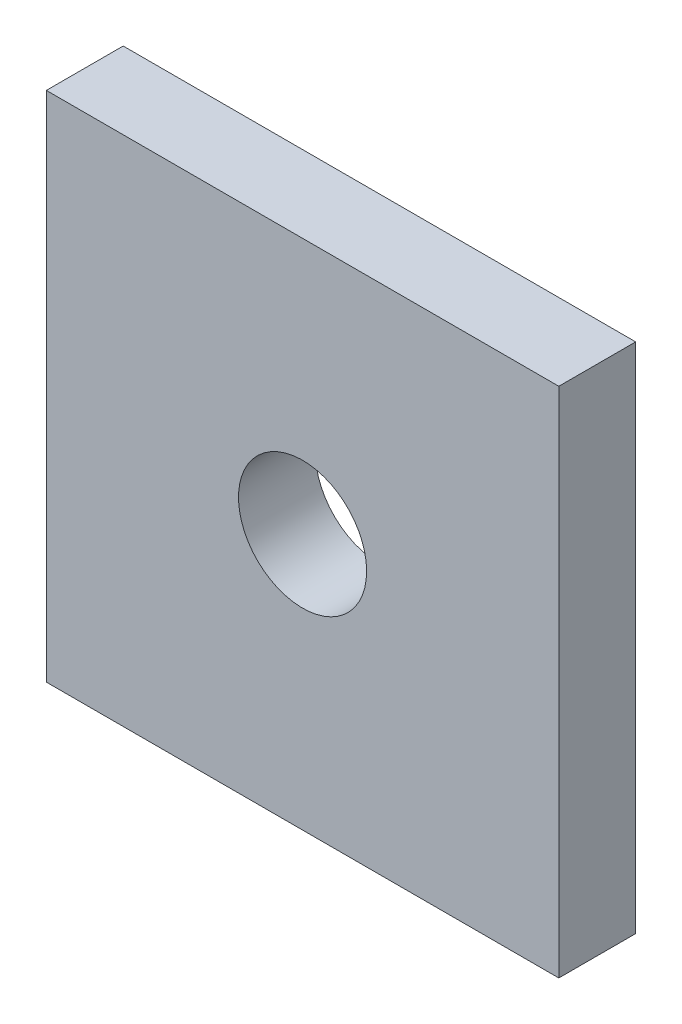
ISO-10303-21;
HEADER;
FILE_DESCRIPTION(('STEP AP214'),'2;1');
FILE_NAME('part.step','',(''),(''),'','','');
FILE_SCHEMA(('AUTOMOTIVE_DESIGN { 1 0 10303 214 1 1 1 1 }'));
ENDSEC;
DATA;
#1=APPLICATION_CONTEXT('core data for automotive mechanical design processes');
#2=APPLICATION_PROTOCOL_DEFINITION('international standard','automotive_design',2000,#1);
#3=PRODUCT_CONTEXT('',#1,'mechanical');
#4=PRODUCT('Part','Part','',(#3));
#5=PRODUCT_RELATED_PRODUCT_CATEGORY('part','',(#4));
#6=PRODUCT_DEFINITION_FORMATION('','',#4);
#7=PRODUCT_DEFINITION_CONTEXT('part definition',#1,'design');
#8=PRODUCT_DEFINITION('design','',#6,#7);
#9=PRODUCT_DEFINITION_SHAPE('','',#8);
#10=(LENGTH_UNIT() NAMED_UNIT(*) SI_UNIT(.MILLI.,.METRE.));
#11=(NAMED_UNIT(*) PLANE_ANGLE_UNIT() SI_UNIT($,.RADIAN.));
#12=(NAMED_UNIT(*) SI_UNIT($,.STERADIAN.) SOLID_ANGLE_UNIT());
#13=UNCERTAINTY_MEASURE_WITH_UNIT(LENGTH_MEASURE(1.E-05),#10,'distance_accuracy_value','');
#14=(GEOMETRIC_REPRESENTATION_CONTEXT(3) GLOBAL_UNCERTAINTY_ASSIGNED_CONTEXT((#13)) GLOBAL_UNIT_ASSIGNED_CONTEXT((#10,
#11,#12)) REPRESENTATION_CONTEXT('',''));
#15=CARTESIAN_POINT('',(0.,0.,0.));
#16=DIRECTION('',(0.,0.,1.));
#17=DIRECTION('',(1.,0.,0.));
#18=AXIS2_PLACEMENT_3D('',#15,#16,#17);
#19=CARTESIAN_POINT('',(0.,0.,3.));
#20=DIRECTION('',(0.,0.,-1.));
#21=DIRECTION('',(-1.,0.,0.));
#22=AXIS2_PLACEMENT_3D('',#19,#20,#21);
#23=PLANE('',#22);
#24=DIRECTION('',(0.,-1.,0.));
#25=VECTOR('',#24,1.);
#26=CARTESIAN_POINT('',(-10.,10.,3.));
#27=LINE('',#26,#25);
#28=CARTESIAN_POINT('',(-10.,10.,3.));
#29=VERTEX_POINT('',#28);
#30=CARTESIAN_POINT('',(-10.,-10.,3.));
#31=VERTEX_POINT('',#30);
#32=EDGE_CURVE('E91',#29,#31,#27,.T.);
#33=ORIENTED_EDGE('',*,*,#32,.T.);
#34=DIRECTION('',(1.,0.,0.));
#35=VECTOR('',#34,1.);
#36=CARTESIAN_POINT('',(10.,-10.,3.));
#37=LINE('',#36,#35);
#38=CARTESIAN_POINT('',(10.,-10.,3.));
#39=VERTEX_POINT('',#38);
#40=EDGE_CURVE('E86',#31,#39,#37,.T.);
#41=ORIENTED_EDGE('',*,*,#40,.T.);
#42=DIRECTION('',(0.,1.,0.));
#43=VECTOR('',#42,1.);
#44=CARTESIAN_POINT('',(10.,10.,3.));
#45=LINE('',#44,#43);
#46=CARTESIAN_POINT('',(10.,10.,3.));
#47=VERTEX_POINT('',#46);
#48=EDGE_CURVE('E89',#39,#47,#45,.T.);
#49=ORIENTED_EDGE('',*,*,#48,.T.);
#50=DIRECTION('',(-1.,0.,0.));
#51=VECTOR('',#50,1.);
#52=CARTESIAN_POINT('',(10.,10.,3.));
#53=LINE('',#52,#51);
#54=EDGE_CURVE('E56',#47,#29,#53,.T.);
#55=ORIENTED_EDGE('',*,*,#54,.T.);
#56=EDGE_LOOP('',(#33,#41,#49,#55));
#57=FACE_BOUND('',#56,.T.);
#58=CARTESIAN_POINT('',(0.,0.,3.));
#59=DIRECTION('',(0.,0.,1.));
#60=DIRECTION('',(1.,0.,0.));
#61=AXIS2_PLACEMENT_3D('',#58,#59,#60);
#62=CIRCLE('',#61,2.5);
#63=CARTESIAN_POINT('',(2.5,0.,3.));
#64=VERTEX_POINT('',#63);
#65=EDGE_CURVE('E106',#64,#64,#62,.T.);
#66=ORIENTED_EDGE('',*,*,#65,.F.);
#67=EDGE_LOOP('',(#66));
#68=FACE_BOUND('',#67,.T.);
#69=ADVANCED_FACE('F39',(#57,#68),#23,.F.);
#70=CARTESIAN_POINT('',(0.,0.,0.));
#71=DIRECTION('',(0.,0.,-1.));
#72=DIRECTION('',(-1.,0.,0.));
#73=AXIS2_PLACEMENT_3D('',#70,#71,#72);
#74=PLANE('',#73);
#75=DIRECTION('',(0.,-1.,0.));
#76=VECTOR('',#75,1.);
#77=CARTESIAN_POINT('',(-10.,10.,0.));
#78=LINE('',#77,#76);
#79=CARTESIAN_POINT('',(-10.,10.,0.));
#80=VERTEX_POINT('',#79);
#81=CARTESIAN_POINT('',(-10.,-10.,0.));
#82=VERTEX_POINT('',#81);
#83=EDGE_CURVE('E103',#80,#82,#78,.T.);
#84=ORIENTED_EDGE('',*,*,#83,.F.);
#85=DIRECTION('',(-1.,0.,0.));
#86=VECTOR('',#85,1.);
#87=CARTESIAN_POINT('',(10.,10.,0.));
#88=LINE('',#87,#86);
#89=CARTESIAN_POINT('',(10.,10.,0.));
#90=VERTEX_POINT('',#89);
#91=EDGE_CURVE('E79',#90,#80,#88,.T.);
#92=ORIENTED_EDGE('',*,*,#91,.F.);
#93=DIRECTION('',(0.,1.,0.));
#94=VECTOR('',#93,1.);
#95=CARTESIAN_POINT('',(10.,10.,0.));
#96=LINE('',#95,#94);
#97=CARTESIAN_POINT('',(10.,-10.,0.));
#98=VERTEX_POINT('',#97);
#99=EDGE_CURVE('E73',#98,#90,#96,.T.);
#100=ORIENTED_EDGE('',*,*,#99,.F.);
#101=DIRECTION('',(1.,0.,0.));
#102=VECTOR('',#101,1.);
#103=CARTESIAN_POINT('',(10.,-10.,0.));
#104=LINE('',#103,#102);
#105=EDGE_CURVE('E95',#82,#98,#104,.T.);
#106=ORIENTED_EDGE('',*,*,#105,.F.);
#107=EDGE_LOOP('',(#84,#92,#100,#106));
#108=FACE_BOUND('',#107,.T.);
#109=CARTESIAN_POINT('',(0.,0.,0.));
#110=DIRECTION('',(0.,0.,1.));
#111=DIRECTION('',(1.,0.,0.));
#112=AXIS2_PLACEMENT_3D('',#109,#110,#111);
#113=CIRCLE('',#112,2.5);
#114=CARTESIAN_POINT('',(2.5,0.,0.));
#115=VERTEX_POINT('',#114);
#116=EDGE_CURVE('E118',#115,#115,#113,.T.);
#117=ORIENTED_EDGE('',*,*,#116,.T.);
#118=EDGE_LOOP('',(#117));
#119=FACE_BOUND('',#118,.T.);
#120=ADVANCED_FACE('F114',(#108,#119),#74,.T.);
#121=CARTESIAN_POINT('',(-10.,10.,3.));
#122=DIRECTION('',(1.,0.,0.));
#123=DIRECTION('',(0.,1.,0.));
#124=AXIS2_PLACEMENT_3D('',#121,#122,#123);
#125=PLANE('',#124);
#126=ORIENTED_EDGE('',*,*,#83,.T.);
#127=DIRECTION('',(0.,0.,-1.));
#128=VECTOR('',#127,1.);
#129=CARTESIAN_POINT('',(-10.,-10.,3.));
#130=LINE('',#129,#128);
#131=EDGE_CURVE('E11',#31,#82,#130,.T.);
#132=ORIENTED_EDGE('',*,*,#131,.F.);
#133=ORIENTED_EDGE('',*,*,#32,.F.);
#134=DIRECTION('',(0.,0.,-1.));
#135=VECTOR('',#134,1.);
#136=CARTESIAN_POINT('',(-10.,10.,3.));
#137=LINE('',#136,#135);
#138=EDGE_CURVE('E99',#29,#80,#137,.T.);
#139=ORIENTED_EDGE('',*,*,#138,.T.);
#140=EDGE_LOOP('',(#126,#132,#133,#139));
#141=FACE_BOUND('',#140,.T.);
#142=ADVANCED_FACE('F41',(#141),#125,.F.);
#143=CARTESIAN_POINT('',(10.,-10.,3.));
#144=DIRECTION('',(0.,1.,0.));
#145=DIRECTION('',(-1.,0.,0.));
#146=AXIS2_PLACEMENT_3D('',#143,#144,#145);
#147=PLANE('',#146);
#148=ORIENTED_EDGE('',*,*,#105,.T.);
#149=DIRECTION('',(0.,0.,-1.));
#150=VECTOR('',#149,1.);
#151=CARTESIAN_POINT('',(10.,-10.,3.));
#152=LINE('',#151,#150);
#153=EDGE_CURVE('E48',#39,#98,#152,.T.);
#154=ORIENTED_EDGE('',*,*,#153,.F.);
#155=ORIENTED_EDGE('',*,*,#40,.F.);
#156=ORIENTED_EDGE('',*,*,#131,.T.);
#157=EDGE_LOOP('',(#148,#154,#155,#156));
#158=FACE_BOUND('',#157,.T.);
#159=ADVANCED_FACE('F94',(#158),#147,.F.);
#160=CARTESIAN_POINT('',(10.,10.,3.));
#161=DIRECTION('',(-1.,0.,0.));
#162=DIRECTION('',(0.,-1.,0.));
#163=AXIS2_PLACEMENT_3D('',#160,#161,#162);
#164=PLANE('',#163);
#165=ORIENTED_EDGE('',*,*,#99,.T.);
#166=DIRECTION('',(0.,0.,-1.));
#167=VECTOR('',#166,1.);
#168=CARTESIAN_POINT('',(10.,10.,3.));
#169=LINE('',#168,#167);
#170=EDGE_CURVE('E96',#47,#90,#169,.T.);
#171=ORIENTED_EDGE('',*,*,#170,.F.);
#172=ORIENTED_EDGE('',*,*,#48,.F.);
#173=ORIENTED_EDGE('',*,*,#153,.T.);
#174=EDGE_LOOP('',(#165,#171,#172,#173));
#175=FACE_BOUND('',#174,.T.);
#176=ADVANCED_FACE('F97',(#175),#164,.F.);
#177=CARTESIAN_POINT('',(10.,10.,3.));
#178=DIRECTION('',(0.,-1.,0.));
#179=DIRECTION('',(1.,0.,0.));
#180=AXIS2_PLACEMENT_3D('',#177,#178,#179);
#181=PLANE('',#180);
#182=ORIENTED_EDGE('',*,*,#91,.T.);
#183=ORIENTED_EDGE('',*,*,#138,.F.);
#184=ORIENTED_EDGE('',*,*,#54,.F.);
#185=ORIENTED_EDGE('',*,*,#170,.T.);
#186=EDGE_LOOP('',(#182,#183,#184,#185));
#187=FACE_BOUND('',#186,.T.);
#188=ADVANCED_FACE('F111',(#187),#181,.F.);
#189=CARTESIAN_POINT('',(0.,0.,3.));
#190=DIRECTION('',(0.,0.,-1.));
#191=DIRECTION('',(-1.,0.,0.));
#192=AXIS2_PLACEMENT_3D('',#189,#190,#191);
#193=CYLINDRICAL_SURFACE('',#192,2.5);
#194=ORIENTED_EDGE('',*,*,#65,.T.);
#195=EDGE_LOOP('',(#194));
#196=FACE_BOUND('',#195,.T.);
#197=ORIENTED_EDGE('',*,*,#116,.F.);
#198=EDGE_LOOP('',(#197));
#199=FACE_BOUND('',#198,.T.);
#200=ADVANCED_FACE('F124',(#196,#199),#193,.F.);
#201=CLOSED_SHELL('',(#69,#120,#142,#159,#176,#188,#200));
#202=MANIFOLD_SOLID_BREP('B2',#201);
#203=ADVANCED_BREP_SHAPE_REPRESENTATION('',(#18,#202),#14);
#204=SHAPE_DEFINITION_REPRESENTATION(#9,#203);
ENDSEC;
END-ISO-10303-21;
